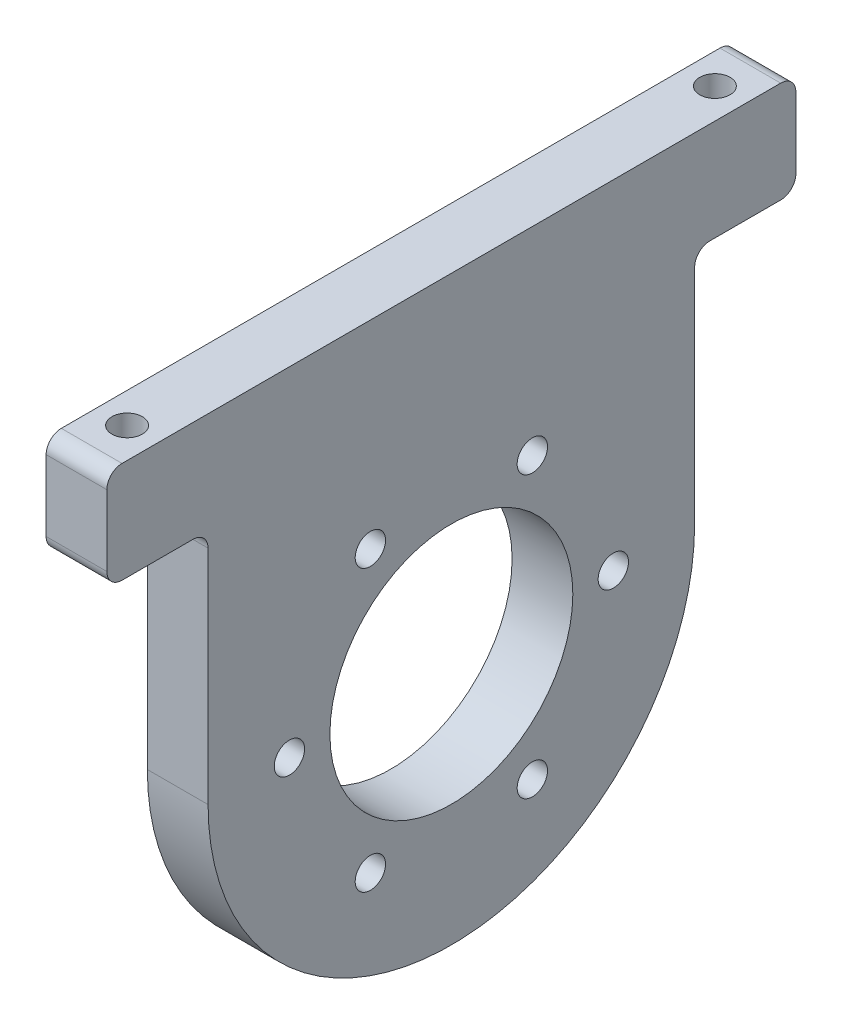
ISO-10303-21;
HEADER;
FILE_DESCRIPTION(('STEP AP214'),'2;1');
FILE_NAME('part.step','',(''),(''),'','','');
FILE_SCHEMA(('AUTOMOTIVE_DESIGN { 1 0 10303 214 1 1 1 1 }'));
ENDSEC;
DATA;
#1=APPLICATION_CONTEXT('core data for automotive mechanical design processes');
#2=APPLICATION_PROTOCOL_DEFINITION('international standard','automotive_design',2000,#1);
#3=PRODUCT_CONTEXT('',#1,'mechanical');
#4=PRODUCT('Part','Part','',(#3));
#5=PRODUCT_RELATED_PRODUCT_CATEGORY('part','',(#4));
#6=PRODUCT_DEFINITION_FORMATION('','',#4);
#7=PRODUCT_DEFINITION_CONTEXT('part definition',#1,'design');
#8=PRODUCT_DEFINITION('design','',#6,#7);
#9=PRODUCT_DEFINITION_SHAPE('','',#8);
#10=(LENGTH_UNIT() NAMED_UNIT(*) SI_UNIT(.MILLI.,.METRE.));
#11=(NAMED_UNIT(*) PLANE_ANGLE_UNIT() SI_UNIT($,.RADIAN.));
#12=(NAMED_UNIT(*) SI_UNIT($,.STERADIAN.) SOLID_ANGLE_UNIT());
#13=UNCERTAINTY_MEASURE_WITH_UNIT(LENGTH_MEASURE(1.E-05),#10,'distance_accuracy_value','');
#14=(GEOMETRIC_REPRESENTATION_CONTEXT(3) GLOBAL_UNCERTAINTY_ASSIGNED_CONTEXT((#13)) GLOBAL_UNIT_ASSIGNED_CONTEXT((#10,
#11,#12)) REPRESENTATION_CONTEXT('',''));
#15=CARTESIAN_POINT('',(0.,0.,0.));
#16=DIRECTION('',(0.,0.,1.));
#17=DIRECTION('',(1.,0.,0.));
#18=AXIS2_PLACEMENT_3D('',#15,#16,#17);
#19=CARTESIAN_POINT('',(6.,0.,0.));
#20=DIRECTION('',(0.,1.,0.));
#21=DIRECTION('',(0.,0.,1.));
#22=AXIS2_PLACEMENT_3D('',#19,#20,#21);
#23=PLANE('',#22);
#24=DIRECTION('',(0.,0.,-1.));
#25=VECTOR('',#24,1.);
#26=CARTESIAN_POINT('',(6.,0.,0.));
#27=LINE('',#26,#25);
#28=CARTESIAN_POINT('',(6.,0.,-1.5));
#29=VERTEX_POINT('',#28);
#30=CARTESIAN_POINT('',(6.,0.,-66.5694084));
#31=VERTEX_POINT('',#30);
#32=EDGE_CURVE('E288',#29,#31,#27,.T.);
#33=ORIENTED_EDGE('',*,*,#32,.T.);
#34=DIRECTION('',(-1.,0.,0.));
#35=VECTOR('',#34,1.);
#36=CARTESIAN_POINT('',(0.,0.,-66.5694084));
#37=LINE('',#36,#35);
#38=CARTESIAN_POINT('',(0.,0.,-66.5694084));
#39=VERTEX_POINT('',#38);
#40=EDGE_CURVE('E187',#31,#39,#37,.T.);
#41=ORIENTED_EDGE('',*,*,#40,.T.);
#42=DIRECTION('',(0.,0.,-1.));
#43=VECTOR('',#42,1.);
#44=CARTESIAN_POINT('',(0.,0.,0.));
#45=LINE('',#44,#43);
#46=CARTESIAN_POINT('',(0.,0.,-1.5));
#47=VERTEX_POINT('',#46);
#48=EDGE_CURVE('E318',#47,#39,#45,.T.);
#49=ORIENTED_EDGE('',*,*,#48,.F.);
#50=DIRECTION('',(-1.,0.,0.));
#51=VECTOR('',#50,1.);
#52=CARTESIAN_POINT('',(6.,0.,-1.5));
#53=LINE('',#52,#51);
#54=EDGE_CURVE('E185',#47,#29,#53,.F.);
#55=ORIENTED_EDGE('',*,*,#54,.T.);
#56=EDGE_LOOP('',(#33,#41,#49,#55));
#57=FACE_BOUND('',#56,.T.);
#58=CARTESIAN_POINT('',(3.,0.,-5.));
#59=DIRECTION('',(0.,1.,0.));
#60=DIRECTION('',(0.,0.,1.));
#61=AXIS2_PLACEMENT_3D('',#58,#59,#60);
#62=CIRCLE('',#61,1.5);
#63=CARTESIAN_POINT('',(3.,0.,-3.5));
#64=VERTEX_POINT('',#63);
#65=EDGE_CURVE('E412',#64,#64,#62,.T.);
#66=ORIENTED_EDGE('',*,*,#65,.F.);
#67=EDGE_LOOP('',(#66));
#68=FACE_BOUND('',#67,.T.);
#69=CARTESIAN_POINT('',(2.99999999999999,0.,-63.0694084));
#70=DIRECTION('',(0.,1.,0.));
#71=DIRECTION('',(0.,0.,1.));
#72=AXIS2_PLACEMENT_3D('',#69,#70,#71);
#73=CIRCLE('',#72,1.5);
#74=CARTESIAN_POINT('',(2.99999999999999,0.,-61.5694084));
#75=VERTEX_POINT('',#74);
#76=EDGE_CURVE('E413',#75,#75,#73,.F.);
#77=ORIENTED_EDGE('',*,*,#76,.T.);
#78=EDGE_LOOP('',(#77));
#79=FACE_BOUND('',#78,.T.);
#80=ADVANCED_FACE('F45',(#57,#68,#79),#23,.T.);
#81=CARTESIAN_POINT('',(6.,0.,-10.));
#82=DIRECTION('',(0.,0.,-1.));
#83=DIRECTION('',(0.,1.,0.));
#84=AXIS2_PLACEMENT_3D('',#81,#82,#83);
#85=PLANE('',#84);
#86=DIRECTION('',(0.,-1.,0.));
#87=VECTOR('',#86,1.);
#88=CARTESIAN_POINT('',(6.,0.,-10.));
#89=LINE('',#88,#87);
#90=CARTESIAN_POINT('',(6.,-11.5,-10.));
#91=VERTEX_POINT('',#90);
#92=CARTESIAN_POINT('',(6.,-33.4393103446758,-10.));
#93=VERTEX_POINT('',#92);
#94=EDGE_CURVE('E145',#91,#93,#89,.T.);
#95=ORIENTED_EDGE('',*,*,#94,.F.);
#96=DIRECTION('',(-1.,0.,0.));
#97=VECTOR('',#96,1.);
#98=CARTESIAN_POINT('',(0.,-11.5,-10.));
#99=LINE('',#98,#97);
#100=CARTESIAN_POINT('',(0.,-11.5,-10.));
#101=VERTEX_POINT('',#100);
#102=EDGE_CURVE('E210',#91,#101,#99,.T.);
#103=ORIENTED_EDGE('',*,*,#102,.T.);
#104=DIRECTION('',(0.,-1.,0.));
#105=VECTOR('',#104,1.);
#106=CARTESIAN_POINT('',(0.,0.,-10.));
#107=LINE('',#106,#105);
#108=CARTESIAN_POINT('',(0.,-33.4393103446758,-10.));
#109=VERTEX_POINT('',#108);
#110=EDGE_CURVE('E171',#101,#109,#107,.T.);
#111=ORIENTED_EDGE('',*,*,#110,.T.);
#112=DIRECTION('',(-1.,0.,0.));
#113=VECTOR('',#112,1.);
#114=CARTESIAN_POINT('',(6.,-33.4393103446758,-10.));
#115=LINE('',#114,#113);
#116=EDGE_CURVE('E163',#93,#109,#115,.T.);
#117=ORIENTED_EDGE('',*,*,#116,.F.);
#118=EDGE_LOOP('',(#95,#103,#111,#117));
#119=FACE_BOUND('',#118,.T.);
#120=ADVANCED_FACE('F169',(#119),#85,.F.);
#121=CARTESIAN_POINT('',(6.,-33.4393103446758,-34.0347042));
#122=DIRECTION('',(-1.,0.,0.));
#123=DIRECTION('',(0.,0.,1.));
#124=AXIS2_PLACEMENT_3D('',#121,#122,#123);
#125=CYLINDRICAL_SURFACE('',#124,24.0347042);
#126=CARTESIAN_POINT('',(0.,-33.4393103446758,-34.0347042));
#127=DIRECTION('',(1.,0.,0.));
#128=DIRECTION('',(0.,0.,-1.));
#129=AXIS2_PLACEMENT_3D('',#126,#127,#128);
#130=CIRCLE('',#129,24.0347042);
#131=CARTESIAN_POINT('',(0.,-33.4393103446758,-58.0694084));
#132=VERTEX_POINT('',#131);
#133=EDGE_CURVE('E306',#109,#132,#130,.T.);
#134=ORIENTED_EDGE('',*,*,#133,.T.);
#135=DIRECTION('',(-1.,0.,0.));
#136=VECTOR('',#135,1.);
#137=CARTESIAN_POINT('',(6.,-33.4393103446758,-58.0694084));
#138=LINE('',#137,#136);
#139=CARTESIAN_POINT('',(6.,-33.4393103446758,-58.0694084));
#140=VERTEX_POINT('',#139);
#141=EDGE_CURVE('E165',#140,#132,#138,.T.);
#142=ORIENTED_EDGE('',*,*,#141,.F.);
#143=CARTESIAN_POINT('',(6.,-33.4393103446758,-34.0347042));
#144=DIRECTION('',(1.,0.,0.));
#145=DIRECTION('',(0.,0.,-1.));
#146=AXIS2_PLACEMENT_3D('',#143,#144,#145);
#147=CIRCLE('',#146,24.0347042);
#148=EDGE_CURVE('E151',#93,#140,#147,.T.);
#149=ORIENTED_EDGE('',*,*,#148,.F.);
#150=ORIENTED_EDGE('',*,*,#116,.T.);
#151=EDGE_LOOP('',(#134,#142,#149,#150));
#152=FACE_BOUND('',#151,.T.);
#153=ADVANCED_FACE('F162',(#152),#125,.T.);
#154=CARTESIAN_POINT('',(6.,0.,-58.0694084));
#155=DIRECTION('',(0.,0.,1.));
#156=DIRECTION('',(1.,0.,0.));
#157=AXIS2_PLACEMENT_3D('',#154,#155,#156);
#158=PLANE('',#157);
#159=DIRECTION('',(0.,1.,0.));
#160=VECTOR('',#159,1.);
#161=CARTESIAN_POINT('',(0.,0.,-58.0694084));
#162=LINE('',#161,#160);
#163=CARTESIAN_POINT('',(0.,-11.5,-58.0694084));
#164=VERTEX_POINT('',#163);
#165=EDGE_CURVE('E309',#132,#164,#162,.T.);
#166=ORIENTED_EDGE('',*,*,#165,.T.);
#167=DIRECTION('',(-1.,0.,0.));
#168=VECTOR('',#167,1.);
#169=CARTESIAN_POINT('',(6.,-11.5,-58.0694084));
#170=LINE('',#169,#168);
#171=CARTESIAN_POINT('',(6.,-11.5,-58.0694084));
#172=VERTEX_POINT('',#171);
#173=EDGE_CURVE('E183',#164,#172,#170,.F.);
#174=ORIENTED_EDGE('',*,*,#173,.T.);
#175=DIRECTION('',(0.,1.,0.));
#176=VECTOR('',#175,1.);
#177=CARTESIAN_POINT('',(6.,0.,-58.0694084));
#178=LINE('',#177,#176);
#179=EDGE_CURVE('E167',#140,#172,#178,.T.);
#180=ORIENTED_EDGE('',*,*,#179,.F.);
#181=ORIENTED_EDGE('',*,*,#141,.T.);
#182=EDGE_LOOP('',(#166,#174,#180,#181));
#183=FACE_BOUND('',#182,.T.);
#184=ADVANCED_FACE('F268',(#183),#158,.F.);
#185=CARTESIAN_POINT('',(6.,-10.,0.));
#186=DIRECTION('',(0.,1.,0.));
#187=DIRECTION('',(0.,0.,1.));
#188=AXIS2_PLACEMENT_3D('',#185,#186,#187);
#189=PLANE('',#188);
#190=CARTESIAN_POINT('',(2.99999999999999,-10.,-63.0694084));
#191=DIRECTION('',(0.,1.,0.));
#192=DIRECTION('',(0.,0.,1.));
#193=AXIS2_PLACEMENT_3D('',#190,#191,#192);
#194=CIRCLE('',#193,1.5);
#195=CARTESIAN_POINT('',(2.99999999999999,-10.,-61.5694084));
#196=VERTEX_POINT('',#195);
#197=EDGE_CURVE('E307',#196,#196,#194,.T.);
#198=ORIENTED_EDGE('',*,*,#197,.T.);
#199=EDGE_LOOP('',(#198));
#200=FACE_BOUND('',#199,.T.);
#201=DIRECTION('',(0.,0.,-1.));
#202=VECTOR('',#201,1.);
#203=CARTESIAN_POINT('',(6.,-10.,0.));
#204=LINE('',#203,#202);
#205=CARTESIAN_POINT('',(6.,-10.,-59.5694084));
#206=VERTEX_POINT('',#205);
#207=CARTESIAN_POINT('',(6.,-10.,-66.5694084));
#208=VERTEX_POINT('',#207);
#209=EDGE_CURVE('E298',#206,#208,#204,.T.);
#210=ORIENTED_EDGE('',*,*,#209,.F.);
#211=DIRECTION('',(-1.,0.,0.));
#212=VECTOR('',#211,1.);
#213=CARTESIAN_POINT('',(0.,-10.,-59.5694084));
#214=LINE('',#213,#212);
#215=CARTESIAN_POINT('',(0.,-10.,-59.5694084));
#216=VERTEX_POINT('',#215);
#217=EDGE_CURVE('E175',#206,#216,#214,.T.);
#218=ORIENTED_EDGE('',*,*,#217,.T.);
#219=DIRECTION('',(0.,0.,-1.));
#220=VECTOR('',#219,1.);
#221=CARTESIAN_POINT('',(0.,-10.,0.));
#222=LINE('',#221,#220);
#223=CARTESIAN_POINT('',(0.,-10.,-66.5694084));
#224=VERTEX_POINT('',#223);
#225=EDGE_CURVE('E312',#216,#224,#222,.T.);
#226=ORIENTED_EDGE('',*,*,#225,.T.);
#227=DIRECTION('',(-1.,0.,0.));
#228=VECTOR('',#227,1.);
#229=CARTESIAN_POINT('',(6.,-10.,-66.5694084));
#230=LINE('',#229,#228);
#231=EDGE_CURVE('E173',#224,#208,#230,.F.);
#232=ORIENTED_EDGE('',*,*,#231,.T.);
#233=EDGE_LOOP('',(#210,#218,#226,#232));
#234=FACE_BOUND('',#233,.T.);
#235=ADVANCED_FACE('F264',(#200,#234),#189,.F.);
#236=CARTESIAN_POINT('',(6.,0.,-68.0694084));
#237=DIRECTION('',(0.,0.,1.));
#238=DIRECTION('',(1.,0.,0.));
#239=AXIS2_PLACEMENT_3D('',#236,#237,#238);
#240=PLANE('',#239);
#241=DIRECTION('',(0.,1.,0.));
#242=VECTOR('',#241,1.);
#243=CARTESIAN_POINT('',(0.,0.,-68.0694084));
#244=LINE('',#243,#242);
#245=CARTESIAN_POINT('',(0.,-8.5,-68.0694084));
#246=VERTEX_POINT('',#245);
#247=CARTESIAN_POINT('',(0.,-1.5,-68.0694084));
#248=VERTEX_POINT('',#247);
#249=EDGE_CURVE('E315',#246,#248,#244,.T.);
#250=ORIENTED_EDGE('',*,*,#249,.T.);
#251=DIRECTION('',(-1.,0.,0.));
#252=VECTOR('',#251,1.);
#253=CARTESIAN_POINT('',(6.,-1.5,-68.0694084));
#254=LINE('',#253,#252);
#255=CARTESIAN_POINT('',(6.,-1.5,-68.0694084));
#256=VERTEX_POINT('',#255);
#257=EDGE_CURVE('E201',#248,#256,#254,.F.);
#258=ORIENTED_EDGE('',*,*,#257,.T.);
#259=DIRECTION('',(0.,1.,0.));
#260=VECTOR('',#259,1.);
#261=CARTESIAN_POINT('',(6.,0.,-68.0694084));
#262=LINE('',#261,#260);
#263=CARTESIAN_POINT('',(6.,-8.5,-68.0694084));
#264=VERTEX_POINT('',#263);
#265=EDGE_CURVE('E291',#264,#256,#262,.T.);
#266=ORIENTED_EDGE('',*,*,#265,.F.);
#267=DIRECTION('',(-1.,0.,0.));
#268=VECTOR('',#267,1.);
#269=CARTESIAN_POINT('',(6.,-8.5,-68.0694084));
#270=LINE('',#269,#268);
#271=EDGE_CURVE('E198',#264,#246,#270,.T.);
#272=ORIENTED_EDGE('',*,*,#271,.T.);
#273=EDGE_LOOP('',(#250,#258,#266,#272));
#274=FACE_BOUND('',#273,.T.);
#275=ADVANCED_FACE('F261',(#274),#240,.F.);
#276=CARTESIAN_POINT('',(6.,0.,0.));
#277=DIRECTION('',(0.,0.,-1.));
#278=DIRECTION('',(0.,1.,0.));
#279=AXIS2_PLACEMENT_3D('',#276,#277,#278);
#280=PLANE('',#279);
#281=DIRECTION('',(0.,-1.,0.));
#282=VECTOR('',#281,1.);
#283=CARTESIAN_POINT('',(0.,0.,0.));
#284=LINE('',#283,#282);
#285=CARTESIAN_POINT('',(0.,-1.5,0.));
#286=VERTEX_POINT('',#285);
#287=CARTESIAN_POINT('',(0.,-8.5,0.));
#288=VERTEX_POINT('',#287);
#289=EDGE_CURVE('E233',#286,#288,#284,.T.);
#290=ORIENTED_EDGE('',*,*,#289,.T.);
#291=DIRECTION('',(-1.,0.,0.));
#292=VECTOR('',#291,1.);
#293=CARTESIAN_POINT('',(6.,-8.5,0.));
#294=LINE('',#293,#292);
#295=CARTESIAN_POINT('',(6.,-8.5,0.));
#296=VERTEX_POINT('',#295);
#297=EDGE_CURVE('E219',#288,#296,#294,.F.);
#298=ORIENTED_EDGE('',*,*,#297,.T.);
#299=DIRECTION('',(0.,-1.,0.));
#300=VECTOR('',#299,1.);
#301=CARTESIAN_POINT('',(6.,0.,0.));
#302=LINE('',#301,#300);
#303=CARTESIAN_POINT('',(6.,-1.5,0.));
#304=VERTEX_POINT('',#303);
#305=EDGE_CURVE('E294',#304,#296,#302,.T.);
#306=ORIENTED_EDGE('',*,*,#305,.F.);
#307=DIRECTION('',(-1.,0.,0.));
#308=VECTOR('',#307,1.);
#309=CARTESIAN_POINT('',(0.,-1.5,0.));
#310=LINE('',#309,#308);
#311=EDGE_CURVE('E216',#304,#286,#310,.T.);
#312=ORIENTED_EDGE('',*,*,#311,.T.);
#313=EDGE_LOOP('',(#290,#298,#306,#312));
#314=FACE_BOUND('',#313,.T.);
#315=ADVANCED_FACE('F259',(#314),#280,.F.);
#316=CARTESIAN_POINT('',(6.,-10.,0.));
#317=DIRECTION('',(0.,1.,0.));
#318=DIRECTION('',(0.,0.,1.));
#319=AXIS2_PLACEMENT_3D('',#316,#317,#318);
#320=PLANE('',#319);
#321=CARTESIAN_POINT('',(3.,-10.,-5.));
#322=DIRECTION('',(0.,1.,0.));
#323=DIRECTION('',(0.,0.,1.));
#324=AXIS2_PLACEMENT_3D('',#321,#322,#323);
#325=CIRCLE('',#324,1.5);
#326=CARTESIAN_POINT('',(3.,-10.,-3.5));
#327=VERTEX_POINT('',#326);
#328=EDGE_CURVE('E416',#327,#327,#325,.F.);
#329=ORIENTED_EDGE('',*,*,#328,.F.);
#330=EDGE_LOOP('',(#329));
#331=FACE_BOUND('',#330,.T.);
#332=DIRECTION('',(0.,0.,-1.));
#333=VECTOR('',#332,1.);
#334=CARTESIAN_POINT('',(0.,-10.,0.));
#335=LINE('',#334,#333);
#336=CARTESIAN_POINT('',(0.,-10.,-1.5));
#337=VERTEX_POINT('',#336);
#338=CARTESIAN_POINT('',(0.,-10.,-8.5));
#339=VERTEX_POINT('',#338);
#340=EDGE_CURVE('E229',#337,#339,#335,.T.);
#341=ORIENTED_EDGE('',*,*,#340,.T.);
#342=DIRECTION('',(-1.,0.,0.));
#343=VECTOR('',#342,1.);
#344=CARTESIAN_POINT('',(6.,-10.,-8.5));
#345=LINE('',#344,#343);
#346=CARTESIAN_POINT('',(6.,-10.,-8.5));
#347=VERTEX_POINT('',#346);
#348=EDGE_CURVE('E60',#339,#347,#345,.F.);
#349=ORIENTED_EDGE('',*,*,#348,.T.);
#350=DIRECTION('',(0.,0.,-1.));
#351=VECTOR('',#350,1.);
#352=CARTESIAN_POINT('',(6.,-10.,0.));
#353=LINE('',#352,#351);
#354=CARTESIAN_POINT('',(6.,-10.,-1.5));
#355=VERTEX_POINT('',#354);
#356=EDGE_CURVE('E296',#355,#347,#353,.T.);
#357=ORIENTED_EDGE('',*,*,#356,.F.);
#358=DIRECTION('',(-1.,0.,0.));
#359=VECTOR('',#358,1.);
#360=CARTESIAN_POINT('',(6.,-10.,-1.5));
#361=LINE('',#360,#359);
#362=EDGE_CURVE('E212',#355,#337,#361,.T.);
#363=ORIENTED_EDGE('',*,*,#362,.T.);
#364=EDGE_LOOP('',(#341,#349,#357,#363));
#365=FACE_BOUND('',#364,.T.);
#366=ADVANCED_FACE('F231',(#331,#365),#320,.F.);
#367=CARTESIAN_POINT('',(6.,-33.4393103446758,-34.0347042));
#368=DIRECTION('',(-1.,0.,0.));
#369=DIRECTION('',(0.,0.,1.));
#370=AXIS2_PLACEMENT_3D('',#367,#368,#369);
#371=CYLINDRICAL_SURFACE('',#370,12.);
#372=CARTESIAN_POINT('',(6.,-33.4393103446758,-34.0347042));
#373=DIRECTION('',(1.,0.,0.));
#374=DIRECTION('',(0.,0.,-1.));
#375=AXIS2_PLACEMENT_3D('',#372,#373,#374);
#376=CIRCLE('',#375,12.);
#377=CARTESIAN_POINT('',(6.,-33.4393103446758,-46.0347042));
#378=VERTEX_POINT('',#377);
#379=EDGE_CURVE('E177',#378,#378,#376,.T.);
#380=ORIENTED_EDGE('',*,*,#379,.T.);
#381=EDGE_LOOP('',(#380));
#382=FACE_BOUND('',#381,.T.);
#383=CARTESIAN_POINT('',(0.,-33.4393103446758,-34.0347042));
#384=DIRECTION('',(1.,0.,0.));
#385=DIRECTION('',(0.,0.,-1.));
#386=AXIS2_PLACEMENT_3D('',#383,#384,#385);
#387=CIRCLE('',#386,12.);
#388=CARTESIAN_POINT('',(0.,-33.4393103446758,-46.0347042));
#389=VERTEX_POINT('',#388);
#390=EDGE_CURVE('E158',#389,#389,#387,.T.);
#391=ORIENTED_EDGE('',*,*,#390,.F.);
#392=EDGE_LOOP('',(#391));
#393=FACE_BOUND('',#392,.T.);
#394=ADVANCED_FACE('F324',(#382,#393),#371,.F.);
#395=CARTESIAN_POINT('',(6.,0.,0.));
#396=DIRECTION('',(1.,0.,0.));
#397=DIRECTION('',(0.,0.,-1.));
#398=AXIS2_PLACEMENT_3D('',#395,#396,#397);
#399=PLANE('',#398);
#400=CARTESIAN_POINT('',(6.,-47.2957168052268,-26.0347042));
#401=DIRECTION('',(1.,0.,0.));
#402=DIRECTION('',(0.,0.,-1.));
#403=AXIS2_PLACEMENT_3D('',#400,#401,#402);
#404=CIRCLE('',#403,1.5);
#405=CARTESIAN_POINT('',(6.,-47.2957168052268,-27.5347042));
#406=VERTEX_POINT('',#405);
#407=EDGE_CURVE('E402',#406,#406,#404,.T.);
#408=ORIENTED_EDGE('',*,*,#407,.F.);
#409=EDGE_LOOP('',(#408));
#410=FACE_BOUND('',#409,.T.);
#411=CARTESIAN_POINT('',(6.,-33.4393103446757,-50.0347042));
#412=DIRECTION('',(1.,0.,0.));
#413=DIRECTION('',(0.,0.,-1.));
#414=AXIS2_PLACEMENT_3D('',#411,#412,#413);
#415=CIRCLE('',#414,1.50000000000004);
#416=CARTESIAN_POINT('',(6.,-33.4393103446757,-51.5347042000001));
#417=VERTEX_POINT('',#416);
#418=EDGE_CURVE('E396',#417,#417,#415,.T.);
#419=ORIENTED_EDGE('',*,*,#418,.F.);
#420=EDGE_LOOP('',(#419));
#421=FACE_BOUND('',#420,.T.);
#422=CARTESIAN_POINT('',(6.,-19.5829038841247,-42.0347041999999));
#423=DIRECTION('',(1.,0.,0.));
#424=DIRECTION('',(0.,0.,-1.));
#425=AXIS2_PLACEMENT_3D('',#422,#423,#424);
#426=CIRCLE('',#425,1.5);
#427=CARTESIAN_POINT('',(6.,-19.5829038841247,-43.5347041999999));
#428=VERTEX_POINT('',#427);
#429=EDGE_CURVE('E390',#428,#428,#426,.T.);
#430=ORIENTED_EDGE('',*,*,#429,.F.);
#431=EDGE_LOOP('',(#430));
#432=FACE_BOUND('',#431,.T.);
#433=CARTESIAN_POINT('',(6.,-33.4393103446757,-18.0347042));
#434=DIRECTION('',(1.,0.,0.));
#435=DIRECTION('',(0.,0.,-1.));
#436=AXIS2_PLACEMENT_3D('',#433,#434,#435);
#437=CIRCLE('',#436,1.50000000000005);
#438=CARTESIAN_POINT('',(6.,-33.4393103446757,-19.5347042000001));
#439=VERTEX_POINT('',#438);
#440=EDGE_CURVE('E384',#439,#439,#437,.T.);
#441=ORIENTED_EDGE('',*,*,#440,.F.);
#442=EDGE_LOOP('',(#441));
#443=FACE_BOUND('',#442,.T.);
#444=CARTESIAN_POINT('',(6.,-19.5829038841247,-26.0347042));
#445=DIRECTION('',(1.,0.,0.));
#446=DIRECTION('',(0.,0.,-1.));
#447=AXIS2_PLACEMENT_3D('',#444,#445,#446);
#448=CIRCLE('',#447,1.5);
#449=CARTESIAN_POINT('',(6.,-19.5829038841247,-27.5347042));
#450=VERTEX_POINT('',#449);
#451=EDGE_CURVE('E377',#450,#450,#448,.T.);
#452=ORIENTED_EDGE('',*,*,#451,.F.);
#453=EDGE_LOOP('',(#452));
#454=FACE_BOUND('',#453,.T.);
#455=CARTESIAN_POINT('',(6.,-47.2957168052268,-42.0347041999999));
#456=DIRECTION('',(1.,0.,0.));
#457=DIRECTION('',(0.,0.,-1.));
#458=AXIS2_PLACEMENT_3D('',#455,#456,#457);
#459=CIRCLE('',#458,1.5);
#460=CARTESIAN_POINT('',(6.,-47.2957168052268,-43.5347041999999));
#461=VERTEX_POINT('',#460);
#462=EDGE_CURVE('E409',#461,#461,#459,.T.);
#463=ORIENTED_EDGE('',*,*,#462,.F.);
#464=EDGE_LOOP('',(#463));
#465=FACE_BOUND('',#464,.T.);
#466=ORIENTED_EDGE('',*,*,#265,.T.);
#467=CARTESIAN_POINT('',(6.,-1.5,-66.5694084));
#468=DIRECTION('',(1.,0.,0.));
#469=DIRECTION('',(0.,0.,-1.));
#470=AXIS2_PLACEMENT_3D('',#467,#468,#469);
#471=CIRCLE('',#470,1.5);
#472=EDGE_CURVE('E208',#256,#31,#471,.T.);
#473=ORIENTED_EDGE('',*,*,#472,.T.);
#474=ORIENTED_EDGE('',*,*,#32,.F.);
#475=CARTESIAN_POINT('',(6.,-1.5,-1.5));
#476=DIRECTION('',(1.,0.,0.));
#477=DIRECTION('',(0.,0.,-1.));
#478=AXIS2_PLACEMENT_3D('',#475,#476,#477);
#479=CIRCLE('',#478,1.5);
#480=EDGE_CURVE('E203',#29,#304,#479,.T.);
#481=ORIENTED_EDGE('',*,*,#480,.T.);
#482=ORIENTED_EDGE('',*,*,#305,.T.);
#483=CARTESIAN_POINT('',(6.,-8.5,-1.5));
#484=DIRECTION('',(1.,0.,0.));
#485=DIRECTION('',(0.,0.,-1.));
#486=AXIS2_PLACEMENT_3D('',#483,#484,#485);
#487=CIRCLE('',#486,1.5);
#488=EDGE_CURVE('E67',#296,#355,#487,.T.);
#489=ORIENTED_EDGE('',*,*,#488,.T.);
#490=ORIENTED_EDGE('',*,*,#356,.T.);
#491=CARTESIAN_POINT('',(6.,-11.5,-8.5));
#492=DIRECTION('',(1.,0.,0.));
#493=DIRECTION('',(0.,0.,-1.));
#494=AXIS2_PLACEMENT_3D('',#491,#492,#493);
#495=CIRCLE('',#494,1.5);
#496=EDGE_CURVE('E11',#347,#91,#495,.F.);
#497=ORIENTED_EDGE('',*,*,#496,.T.);
#498=ORIENTED_EDGE('',*,*,#94,.T.);
#499=ORIENTED_EDGE('',*,*,#148,.T.);
#500=ORIENTED_EDGE('',*,*,#179,.T.);
#501=CARTESIAN_POINT('',(6.,-11.5,-59.5694084));
#502=DIRECTION('',(1.,0.,0.));
#503=DIRECTION('',(0.,0.,-1.));
#504=AXIS2_PLACEMENT_3D('',#501,#502,#503);
#505=CIRCLE('',#504,1.5);
#506=EDGE_CURVE('E223',#172,#206,#505,.F.);
#507=ORIENTED_EDGE('',*,*,#506,.T.);
#508=ORIENTED_EDGE('',*,*,#209,.T.);
#509=CARTESIAN_POINT('',(6.,-8.5,-66.5694084));
#510=DIRECTION('',(1.,0.,0.));
#511=DIRECTION('',(0.,0.,-1.));
#512=AXIS2_PLACEMENT_3D('',#509,#510,#511);
#513=CIRCLE('',#512,1.5);
#514=EDGE_CURVE('E206',#208,#264,#513,.T.);
#515=ORIENTED_EDGE('',*,*,#514,.T.);
#516=EDGE_LOOP('',(#466,#473,#474,#481,#482,#489,#490,#497,#498,#499,#500,#507,#508,#515));
#517=FACE_BOUND('',#516,.T.);
#518=ORIENTED_EDGE('',*,*,#379,.F.);
#519=EDGE_LOOP('',(#518));
#520=FACE_BOUND('',#519,.T.);
#521=ADVANCED_FACE('F148',(#410,#421,#432,#443,#454,#465,#517,#520),#399,.T.);
#522=CARTESIAN_POINT('',(0.,0.,0.));
#523=DIRECTION('',(1.,0.,0.));
#524=DIRECTION('',(0.,0.,-1.));
#525=AXIS2_PLACEMENT_3D('',#522,#523,#524);
#526=PLANE('',#525);
#527=CARTESIAN_POINT('',(0.,-47.2957168052268,-26.0347042));
#528=DIRECTION('',(1.,0.,0.));
#529=DIRECTION('',(0.,0.,-1.));
#530=AXIS2_PLACEMENT_3D('',#527,#528,#529);
#531=CIRCLE('',#530,1.5);
#532=CARTESIAN_POINT('',(0.,-47.2957168052268,-27.5347042));
#533=VERTEX_POINT('',#532);
#534=EDGE_CURVE('E399',#533,#533,#531,.T.);
#535=ORIENTED_EDGE('',*,*,#534,.T.);
#536=EDGE_LOOP('',(#535));
#537=FACE_BOUND('',#536,.T.);
#538=CARTESIAN_POINT('',(0.,-33.4393103446757,-50.0347042));
#539=DIRECTION('',(1.,0.,0.));
#540=DIRECTION('',(0.,0.,-1.));
#541=AXIS2_PLACEMENT_3D('',#538,#539,#540);
#542=CIRCLE('',#541,1.50000000000004);
#543=CARTESIAN_POINT('',(0.,-33.4393103446757,-51.5347042000001));
#544=VERTEX_POINT('',#543);
#545=EDGE_CURVE('E393',#544,#544,#542,.T.);
#546=ORIENTED_EDGE('',*,*,#545,.T.);
#547=EDGE_LOOP('',(#546));
#548=FACE_BOUND('',#547,.T.);
#549=CARTESIAN_POINT('',(0.,-19.5829038841247,-42.0347041999999));
#550=DIRECTION('',(1.,0.,0.));
#551=DIRECTION('',(0.,0.,-1.));
#552=AXIS2_PLACEMENT_3D('',#549,#550,#551);
#553=CIRCLE('',#552,1.5);
#554=CARTESIAN_POINT('',(0.,-19.5829038841247,-43.5347041999999));
#555=VERTEX_POINT('',#554);
#556=EDGE_CURVE('E388',#555,#555,#553,.T.);
#557=ORIENTED_EDGE('',*,*,#556,.T.);
#558=EDGE_LOOP('',(#557));
#559=FACE_BOUND('',#558,.T.);
#560=CARTESIAN_POINT('',(0.,-33.4393103446757,-18.0347042));
#561=DIRECTION('',(1.,0.,0.));
#562=DIRECTION('',(0.,0.,-1.));
#563=AXIS2_PLACEMENT_3D('',#560,#561,#562);
#564=CIRCLE('',#563,1.50000000000005);
#565=CARTESIAN_POINT('',(0.,-33.4393103446757,-19.5347042000001));
#566=VERTEX_POINT('',#565);
#567=EDGE_CURVE('E379',#566,#566,#564,.T.);
#568=ORIENTED_EDGE('',*,*,#567,.T.);
#569=EDGE_LOOP('',(#568));
#570=FACE_BOUND('',#569,.T.);
#571=CARTESIAN_POINT('',(0.,-19.5829038841247,-26.0347042));
#572=DIRECTION('',(1.,0.,0.));
#573=DIRECTION('',(0.,0.,-1.));
#574=AXIS2_PLACEMENT_3D('',#571,#572,#573);
#575=CIRCLE('',#574,1.5);
#576=CARTESIAN_POINT('',(0.,-19.5829038841247,-27.5347042));
#577=VERTEX_POINT('',#576);
#578=EDGE_CURVE('E374',#577,#577,#575,.T.);
#579=ORIENTED_EDGE('',*,*,#578,.T.);
#580=EDGE_LOOP('',(#579));
#581=FACE_BOUND('',#580,.T.);
#582=CARTESIAN_POINT('',(0.,-47.2957168052268,-42.0347041999999));
#583=DIRECTION('',(1.,0.,0.));
#584=DIRECTION('',(0.,0.,-1.));
#585=AXIS2_PLACEMENT_3D('',#582,#583,#584);
#586=CIRCLE('',#585,1.5);
#587=CARTESIAN_POINT('',(0.,-47.2957168052268,-43.5347041999999));
#588=VERTEX_POINT('',#587);
#589=EDGE_CURVE('E381',#588,#588,#586,.T.);
#590=ORIENTED_EDGE('',*,*,#589,.T.);
#591=EDGE_LOOP('',(#590));
#592=FACE_BOUND('',#591,.T.);
#593=ORIENTED_EDGE('',*,*,#48,.T.);
#594=CARTESIAN_POINT('',(0.,-1.5,-66.5694084));
#595=DIRECTION('',(1.,0.,0.));
#596=DIRECTION('',(0.,0.,-1.));
#597=AXIS2_PLACEMENT_3D('',#594,#595,#596);
#598=CIRCLE('',#597,1.5);
#599=EDGE_CURVE('E196',#39,#248,#598,.F.);
#600=ORIENTED_EDGE('',*,*,#599,.T.);
#601=ORIENTED_EDGE('',*,*,#249,.F.);
#602=CARTESIAN_POINT('',(0.,-8.5,-66.5694084));
#603=DIRECTION('',(1.,0.,0.));
#604=DIRECTION('',(0.,0.,-1.));
#605=AXIS2_PLACEMENT_3D('',#602,#603,#604);
#606=CIRCLE('',#605,1.5);
#607=EDGE_CURVE('E194',#246,#224,#606,.F.);
#608=ORIENTED_EDGE('',*,*,#607,.T.);
#609=ORIENTED_EDGE('',*,*,#225,.F.);
#610=CARTESIAN_POINT('',(0.,-11.5,-59.5694084));
#611=DIRECTION('',(1.,0.,0.));
#612=DIRECTION('',(0.,0.,-1.));
#613=AXIS2_PLACEMENT_3D('',#610,#611,#612);
#614=CIRCLE('',#613,1.5);
#615=EDGE_CURVE('E221',#216,#164,#614,.T.);
#616=ORIENTED_EDGE('',*,*,#615,.T.);
#617=ORIENTED_EDGE('',*,*,#165,.F.);
#618=ORIENTED_EDGE('',*,*,#133,.F.);
#619=ORIENTED_EDGE('',*,*,#110,.F.);
#620=CARTESIAN_POINT('',(0.,-11.5,-8.5));
#621=DIRECTION('',(1.,0.,0.));
#622=DIRECTION('',(0.,0.,-1.));
#623=AXIS2_PLACEMENT_3D('',#620,#621,#622);
#624=CIRCLE('',#623,1.5);
#625=EDGE_CURVE('E53',#101,#339,#624,.T.);
#626=ORIENTED_EDGE('',*,*,#625,.T.);
#627=ORIENTED_EDGE('',*,*,#340,.F.);
#628=CARTESIAN_POINT('',(0.,-8.5,-1.5));
#629=DIRECTION('',(1.,0.,0.));
#630=DIRECTION('',(0.,0.,-1.));
#631=AXIS2_PLACEMENT_3D('',#628,#629,#630);
#632=CIRCLE('',#631,1.5);
#633=EDGE_CURVE('E192',#337,#288,#632,.F.);
#634=ORIENTED_EDGE('',*,*,#633,.T.);
#635=ORIENTED_EDGE('',*,*,#289,.F.);
#636=CARTESIAN_POINT('',(0.,-1.5,-1.5));
#637=DIRECTION('',(1.,0.,0.));
#638=DIRECTION('',(0.,0.,-1.));
#639=AXIS2_PLACEMENT_3D('',#636,#637,#638);
#640=CIRCLE('',#639,1.5);
#641=EDGE_CURVE('E190',#286,#47,#640,.F.);
#642=ORIENTED_EDGE('',*,*,#641,.T.);
#643=EDGE_LOOP('',(#593,#600,#601,#608,#609,#616,#617,#618,#619,#626,#627,#634,#635,#642));
#644=FACE_BOUND('',#643,.T.);
#645=ORIENTED_EDGE('',*,*,#390,.T.);
#646=EDGE_LOOP('',(#645));
#647=FACE_BOUND('',#646,.T.);
#648=ADVANCED_FACE('F227',(#537,#548,#559,#570,#581,#592,#644,#647),#526,.F.);
#649=CARTESIAN_POINT('',(3.,-14.2426406871193,-5.));
#650=DIRECTION('',(0.,1.,0.));
#651=DIRECTION('',(0.,0.,1.));
#652=AXIS2_PLACEMENT_3D('',#649,#650,#651);
#653=CYLINDRICAL_SURFACE('',#652,1.5);
#654=ORIENTED_EDGE('',*,*,#328,.T.);
#655=EDGE_LOOP('',(#654));
#656=FACE_BOUND('',#655,.T.);
#657=ORIENTED_EDGE('',*,*,#65,.T.);
#658=EDGE_LOOP('',(#657));
#659=FACE_BOUND('',#658,.T.);
#660=ADVANCED_FACE('F337',(#656,#659),#653,.F.);
#661=CARTESIAN_POINT('',(2.99999999999999,-14.2426406871193,-63.0694084));
#662=DIRECTION('',(0.,1.,0.));
#663=DIRECTION('',(0.,0.,1.));
#664=AXIS2_PLACEMENT_3D('',#661,#662,#663);
#665=CYLINDRICAL_SURFACE('',#664,1.5);
#666=ORIENTED_EDGE('',*,*,#197,.F.);
#667=EDGE_LOOP('',(#666));
#668=FACE_BOUND('',#667,.T.);
#669=ORIENTED_EDGE('',*,*,#76,.F.);
#670=EDGE_LOOP('',(#669));
#671=FACE_BOUND('',#670,.T.);
#672=ADVANCED_FACE('F342',(#668,#671),#665,.F.);
#673=CARTESIAN_POINT('',(10.2426406871194,-47.2957168052268,-42.0347041999999));
#674=DIRECTION('',(-1.,0.,0.));
#675=DIRECTION('',(0.,0.,1.));
#676=AXIS2_PLACEMENT_3D('',#673,#674,#675);
#677=CYLINDRICAL_SURFACE('',#676,1.5);
#678=ORIENTED_EDGE('',*,*,#589,.F.);
#679=EDGE_LOOP('',(#678));
#680=FACE_BOUND('',#679,.T.);
#681=ORIENTED_EDGE('',*,*,#462,.T.);
#682=EDGE_LOOP('',(#681));
#683=FACE_BOUND('',#682,.T.);
#684=ADVANCED_FACE('F346',(#680,#683),#677,.F.);
#685=CARTESIAN_POINT('',(10.2426406871194,-19.5829038841247,-26.0347042));
#686=DIRECTION('',(-1.,0.,0.));
#687=DIRECTION('',(0.,0.,1.));
#688=AXIS2_PLACEMENT_3D('',#685,#686,#687);
#689=CYLINDRICAL_SURFACE('',#688,1.5);
#690=ORIENTED_EDGE('',*,*,#578,.F.);
#691=EDGE_LOOP('',(#690));
#692=FACE_BOUND('',#691,.T.);
#693=ORIENTED_EDGE('',*,*,#451,.T.);
#694=EDGE_LOOP('',(#693));
#695=FACE_BOUND('',#694,.T.);
#696=ADVANCED_FACE('F350',(#692,#695),#689,.F.);
#697=CARTESIAN_POINT('',(10.2426406871194,-33.4393103446757,-18.0347042));
#698=DIRECTION('',(-1.,0.,0.));
#699=DIRECTION('',(0.,0.,1.));
#700=AXIS2_PLACEMENT_3D('',#697,#698,#699);
#701=CYLINDRICAL_SURFACE('',#700,1.50000000000005);
#702=ORIENTED_EDGE('',*,*,#567,.F.);
#703=EDGE_LOOP('',(#702));
#704=FACE_BOUND('',#703,.T.);
#705=ORIENTED_EDGE('',*,*,#440,.T.);
#706=EDGE_LOOP('',(#705));
#707=FACE_BOUND('',#706,.T.);
#708=ADVANCED_FACE('F362',(#704,#707),#701,.F.);
#709=CARTESIAN_POINT('',(10.2426406871194,-19.5829038841247,-42.0347041999999));
#710=DIRECTION('',(-1.,0.,0.));
#711=DIRECTION('',(0.,0.,1.));
#712=AXIS2_PLACEMENT_3D('',#709,#710,#711);
#713=CYLINDRICAL_SURFACE('',#712,1.5);
#714=ORIENTED_EDGE('',*,*,#556,.F.);
#715=EDGE_LOOP('',(#714));
#716=FACE_BOUND('',#715,.T.);
#717=ORIENTED_EDGE('',*,*,#429,.T.);
#718=EDGE_LOOP('',(#717));
#719=FACE_BOUND('',#718,.T.);
#720=ADVANCED_FACE('F358',(#716,#719),#713,.F.);
#721=CARTESIAN_POINT('',(10.2426406871194,-33.4393103446757,-50.0347042));
#722=DIRECTION('',(-1.,0.,0.));
#723=DIRECTION('',(0.,0.,1.));
#724=AXIS2_PLACEMENT_3D('',#721,#722,#723);
#725=CYLINDRICAL_SURFACE('',#724,1.50000000000004);
#726=ORIENTED_EDGE('',*,*,#545,.F.);
#727=EDGE_LOOP('',(#726));
#728=FACE_BOUND('',#727,.T.);
#729=ORIENTED_EDGE('',*,*,#418,.T.);
#730=EDGE_LOOP('',(#729));
#731=FACE_BOUND('',#730,.T.);
#732=ADVANCED_FACE('F354',(#728,#731),#725,.F.);
#733=CARTESIAN_POINT('',(10.2426406871194,-47.2957168052268,-26.0347042));
#734=DIRECTION('',(-1.,0.,0.));
#735=DIRECTION('',(0.,0.,1.));
#736=AXIS2_PLACEMENT_3D('',#733,#734,#735);
#737=CYLINDRICAL_SURFACE('',#736,1.5);
#738=ORIENTED_EDGE('',*,*,#534,.F.);
#739=EDGE_LOOP('',(#738));
#740=FACE_BOUND('',#739,.T.);
#741=ORIENTED_EDGE('',*,*,#407,.T.);
#742=EDGE_LOOP('',(#741));
#743=FACE_BOUND('',#742,.T.);
#744=ADVANCED_FACE('F278',(#740,#743),#737,.F.);
#745=CARTESIAN_POINT('',(6.,-11.5,-59.5694084));
#746=DIRECTION('',(1.,0.,0.));
#747=DIRECTION('',(0.,0.,-1.));
#748=AXIS2_PLACEMENT_3D('',#745,#746,#747);
#749=CYLINDRICAL_SURFACE('',#748,1.5);
#750=ORIENTED_EDGE('',*,*,#506,.F.);
#751=ORIENTED_EDGE('',*,*,#173,.F.);
#752=ORIENTED_EDGE('',*,*,#615,.F.);
#753=ORIENTED_EDGE('',*,*,#217,.F.);
#754=EDGE_LOOP('',(#750,#751,#752,#753));
#755=FACE_BOUND('',#754,.T.);
#756=ADVANCED_FACE('F275',(#755),#749,.F.);
#757=CARTESIAN_POINT('',(6.,-1.5,-66.5694084));
#758=DIRECTION('',(1.,0.,0.));
#759=DIRECTION('',(0.,0.,-1.));
#760=AXIS2_PLACEMENT_3D('',#757,#758,#759);
#761=CYLINDRICAL_SURFACE('',#760,1.5);
#762=ORIENTED_EDGE('',*,*,#472,.F.);
#763=ORIENTED_EDGE('',*,*,#257,.F.);
#764=ORIENTED_EDGE('',*,*,#599,.F.);
#765=ORIENTED_EDGE('',*,*,#40,.F.);
#766=EDGE_LOOP('',(#762,#763,#764,#765));
#767=FACE_BOUND('',#766,.T.);
#768=ADVANCED_FACE('F245',(#767),#761,.T.);
#769=CARTESIAN_POINT('',(6.,-8.5,-66.5694084));
#770=DIRECTION('',(-1.,0.,0.));
#771=DIRECTION('',(0.,0.,1.));
#772=AXIS2_PLACEMENT_3D('',#769,#770,#771);
#773=CYLINDRICAL_SURFACE('',#772,1.5);
#774=ORIENTED_EDGE('',*,*,#514,.F.);
#775=ORIENTED_EDGE('',*,*,#231,.F.);
#776=ORIENTED_EDGE('',*,*,#607,.F.);
#777=ORIENTED_EDGE('',*,*,#271,.F.);
#778=EDGE_LOOP('',(#774,#775,#776,#777));
#779=FACE_BOUND('',#778,.T.);
#780=ADVANCED_FACE('F238',(#779),#773,.T.);
#781=CARTESIAN_POINT('',(6.,-11.5,-8.5));
#782=DIRECTION('',(1.,0.,0.));
#783=DIRECTION('',(0.,0.,-1.));
#784=AXIS2_PLACEMENT_3D('',#781,#782,#783);
#785=CYLINDRICAL_SURFACE('',#784,1.5);
#786=ORIENTED_EDGE('',*,*,#496,.F.);
#787=ORIENTED_EDGE('',*,*,#348,.F.);
#788=ORIENTED_EDGE('',*,*,#625,.F.);
#789=ORIENTED_EDGE('',*,*,#102,.F.);
#790=EDGE_LOOP('',(#786,#787,#788,#789));
#791=FACE_BOUND('',#790,.T.);
#792=ADVANCED_FACE('F235',(#791),#785,.F.);
#793=CARTESIAN_POINT('',(6.,-8.5,-1.5));
#794=DIRECTION('',(-1.,0.,0.));
#795=DIRECTION('',(0.,0.,1.));
#796=AXIS2_PLACEMENT_3D('',#793,#794,#795);
#797=CYLINDRICAL_SURFACE('',#796,1.5);
#798=ORIENTED_EDGE('',*,*,#488,.F.);
#799=ORIENTED_EDGE('',*,*,#297,.F.);
#800=ORIENTED_EDGE('',*,*,#633,.F.);
#801=ORIENTED_EDGE('',*,*,#362,.F.);
#802=EDGE_LOOP('',(#798,#799,#800,#801));
#803=FACE_BOUND('',#802,.T.);
#804=ADVANCED_FACE('F237',(#803),#797,.T.);
#805=CARTESIAN_POINT('',(6.,-1.5,-1.5));
#806=DIRECTION('',(1.,0.,0.));
#807=DIRECTION('',(0.,0.,-1.));
#808=AXIS2_PLACEMENT_3D('',#805,#806,#807);
#809=CYLINDRICAL_SURFACE('',#808,1.5);
#810=ORIENTED_EDGE('',*,*,#480,.F.);
#811=ORIENTED_EDGE('',*,*,#54,.F.);
#812=ORIENTED_EDGE('',*,*,#641,.F.);
#813=ORIENTED_EDGE('',*,*,#311,.F.);
#814=EDGE_LOOP('',(#810,#811,#812,#813));
#815=FACE_BOUND('',#814,.T.);
#816=ADVANCED_FACE('F47',(#815),#809,.T.);
#817=CLOSED_SHELL('',(#80,#120,#153,#184,#235,#275,#315,#366,#394,#521,#648,#660,#672,#684,#696,
#708,#720,#732,#744,#756,#768,#780,#792,#804,#816));
#818=MANIFOLD_SOLID_BREP('B2',#817);
#819=ADVANCED_BREP_SHAPE_REPRESENTATION('',(#18,#818),#14);
#820=SHAPE_DEFINITION_REPRESENTATION(#9,#819);
ENDSEC;
END-ISO-10303-21;
